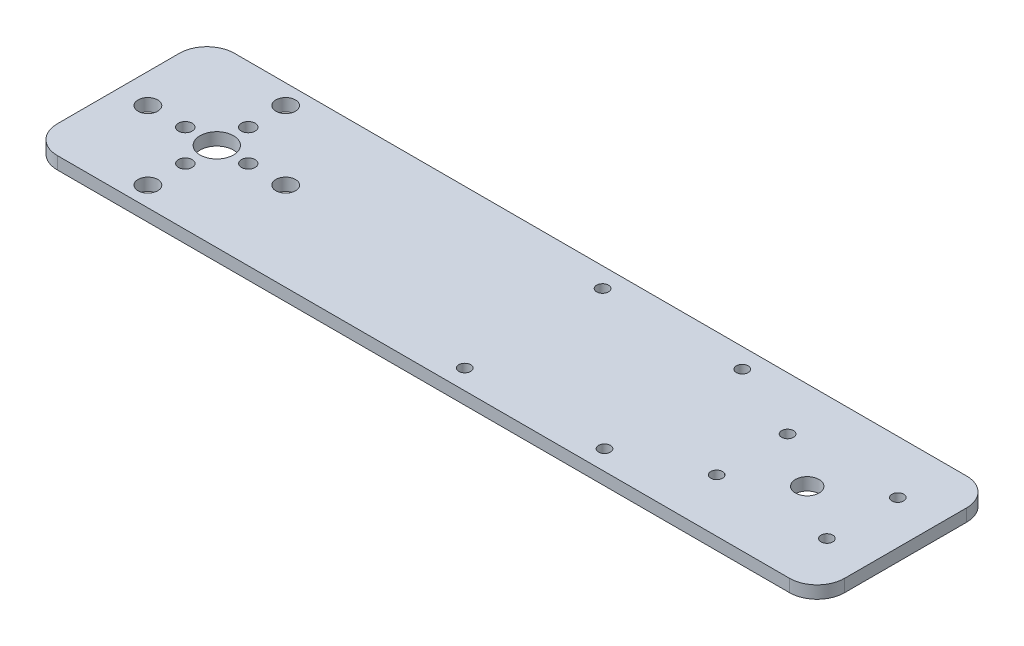
ISO-10303-21;
HEADER;
FILE_DESCRIPTION(('STEP AP214'),'2;1');
FILE_NAME('part.step','',(''),(''),'','','');
FILE_SCHEMA(('AUTOMOTIVE_DESIGN { 1 0 10303 214 1 1 1 1 }'));
ENDSEC;
DATA;
#1=APPLICATION_CONTEXT('core data for automotive mechanical design processes');
#2=APPLICATION_PROTOCOL_DEFINITION('international standard','automotive_design',2000,#1);
#3=PRODUCT_CONTEXT('',#1,'mechanical');
#4=PRODUCT('Part','Part','',(#3));
#5=PRODUCT_RELATED_PRODUCT_CATEGORY('part','',(#4));
#6=PRODUCT_DEFINITION_FORMATION('','',#4);
#7=PRODUCT_DEFINITION_CONTEXT('part definition',#1,'design');
#8=PRODUCT_DEFINITION('design','',#6,#7);
#9=PRODUCT_DEFINITION_SHAPE('','',#8);
#10=(LENGTH_UNIT() NAMED_UNIT(*) SI_UNIT(.MILLI.,.METRE.));
#11=(NAMED_UNIT(*) PLANE_ANGLE_UNIT() SI_UNIT($,.RADIAN.));
#12=(NAMED_UNIT(*) SI_UNIT($,.STERADIAN.) SOLID_ANGLE_UNIT());
#13=UNCERTAINTY_MEASURE_WITH_UNIT(LENGTH_MEASURE(1.E-05),#10,'distance_accuracy_value','');
#14=(GEOMETRIC_REPRESENTATION_CONTEXT(3) GLOBAL_UNCERTAINTY_ASSIGNED_CONTEXT((#13)) GLOBAL_UNIT_ASSIGNED_CONTEXT((#10,
#11,#12)) REPRESENTATION_CONTEXT('',''));
#15=CARTESIAN_POINT('',(0.,0.,0.));
#16=DIRECTION('',(0.,0.,1.));
#17=DIRECTION('',(1.,0.,0.));
#18=AXIS2_PLACEMENT_3D('',#15,#16,#17);
#19=CARTESIAN_POINT('',(-25.,3.175,-22.5));
#20=DIRECTION('',(1.,0.,0.));
#21=DIRECTION('',(0.,0.,-1.));
#22=AXIS2_PLACEMENT_3D('',#19,#20,#21);
#23=PLANE('',#22);
#24=DIRECTION('',(0.,0.,1.));
#25=VECTOR('',#24,1.);
#26=CARTESIAN_POINT('',(-25.,0.,-22.5));
#27=LINE('',#26,#25);
#28=CARTESIAN_POINT('',(-25.,0.,-15.5));
#29=VERTEX_POINT('',#28);
#30=CARTESIAN_POINT('',(-25.,0.,15.5));
#31=VERTEX_POINT('',#30);
#32=EDGE_CURVE('E135',#29,#31,#27,.T.);
#33=ORIENTED_EDGE('',*,*,#32,.T.);
#34=DIRECTION('',(0.,-1.,0.));
#35=VECTOR('',#34,1.);
#36=CARTESIAN_POINT('',(-25.,3.175,15.5));
#37=LINE('',#36,#35);
#38=CARTESIAN_POINT('',(-25.,3.175,15.5));
#39=VERTEX_POINT('',#38);
#40=EDGE_CURVE('E110',#31,#39,#37,.F.);
#41=ORIENTED_EDGE('',*,*,#40,.T.);
#42=DIRECTION('',(0.,0.,1.));
#43=VECTOR('',#42,1.);
#44=CARTESIAN_POINT('',(-25.,3.175,-22.5));
#45=LINE('',#44,#43);
#46=CARTESIAN_POINT('',(-25.,3.175,-15.5));
#47=VERTEX_POINT('',#46);
#48=EDGE_CURVE('E148',#47,#39,#45,.T.);
#49=ORIENTED_EDGE('',*,*,#48,.F.);
#50=DIRECTION('',(0.,-1.,0.));
#51=VECTOR('',#50,1.);
#52=CARTESIAN_POINT('',(-25.,3.175,-15.5));
#53=LINE('',#52,#51);
#54=EDGE_CURVE('E116',#47,#29,#53,.T.);
#55=ORIENTED_EDGE('',*,*,#54,.T.);
#56=EDGE_LOOP('',(#33,#41,#49,#55));
#57=FACE_BOUND('',#56,.T.);
#58=ADVANCED_FACE('F38',(#57),#23,.F.);
#59=CARTESIAN_POINT('',(-25.,3.175,22.5));
#60=DIRECTION('',(0.,0.,-1.));
#61=DIRECTION('',(-1.,0.,0.));
#62=AXIS2_PLACEMENT_3D('',#59,#60,#61);
#63=PLANE('',#62);
#64=DIRECTION('',(1.,0.,0.));
#65=VECTOR('',#64,1.);
#66=CARTESIAN_POINT('',(-25.,3.175,22.5));
#67=LINE('',#66,#65);
#68=CARTESIAN_POINT('',(-18.,3.175,22.5));
#69=VERTEX_POINT('',#68);
#70=CARTESIAN_POINT('',(168.,3.175,22.5));
#71=VERTEX_POINT('',#70);
#72=EDGE_CURVE('E126',#69,#71,#67,.T.);
#73=ORIENTED_EDGE('',*,*,#72,.F.);
#74=DIRECTION('',(0.,-1.,0.));
#75=VECTOR('',#74,1.);
#76=CARTESIAN_POINT('',(-18.,3.175,22.5));
#77=LINE('',#76,#75);
#78=CARTESIAN_POINT('',(-18.,0.,22.5));
#79=VERTEX_POINT('',#78);
#80=EDGE_CURVE('E109',#69,#79,#77,.T.);
#81=ORIENTED_EDGE('',*,*,#80,.T.);
#82=DIRECTION('',(1.,0.,0.));
#83=VECTOR('',#82,1.);
#84=CARTESIAN_POINT('',(-25.,0.,22.5));
#85=LINE('',#84,#83);
#86=CARTESIAN_POINT('',(168.,0.,22.5));
#87=VERTEX_POINT('',#86);
#88=EDGE_CURVE('E123',#79,#87,#85,.T.);
#89=ORIENTED_EDGE('',*,*,#88,.T.);
#90=DIRECTION('',(0.,-1.,0.));
#91=VECTOR('',#90,1.);
#92=CARTESIAN_POINT('',(168.,3.175,22.5));
#93=LINE('',#92,#91);
#94=EDGE_CURVE('E129',#87,#71,#93,.F.);
#95=ORIENTED_EDGE('',*,*,#94,.T.);
#96=EDGE_LOOP('',(#73,#81,#89,#95));
#97=FACE_BOUND('',#96,.T.);
#98=ADVANCED_FACE('F122',(#97),#63,.F.);
#99=CARTESIAN_POINT('',(175.,3.175,-22.5));
#100=DIRECTION('',(-1.,0.,0.));
#101=DIRECTION('',(0.,0.,1.));
#102=AXIS2_PLACEMENT_3D('',#99,#100,#101);
#103=PLANE('',#102);
#104=DIRECTION('',(0.,0.,-1.));
#105=VECTOR('',#104,1.);
#106=CARTESIAN_POINT('',(175.,0.,-22.5));
#107=LINE('',#106,#105);
#108=CARTESIAN_POINT('',(175.,0.,15.5));
#109=VERTEX_POINT('',#108);
#110=CARTESIAN_POINT('',(175.,0.,-15.5));
#111=VERTEX_POINT('',#110);
#112=EDGE_CURVE('E134',#109,#111,#107,.T.);
#113=ORIENTED_EDGE('',*,*,#112,.T.);
#114=DIRECTION('',(0.,-1.,0.));
#115=VECTOR('',#114,1.);
#116=CARTESIAN_POINT('',(175.,3.175,-15.5));
#117=LINE('',#116,#115);
#118=CARTESIAN_POINT('',(175.,3.175,-15.5));
#119=VERTEX_POINT('',#118);
#120=EDGE_CURVE('E11',#111,#119,#117,.F.);
#121=ORIENTED_EDGE('',*,*,#120,.T.);
#122=DIRECTION('',(0.,0.,-1.));
#123=VECTOR('',#122,1.);
#124=CARTESIAN_POINT('',(175.,3.175,-22.5));
#125=LINE('',#124,#123);
#126=CARTESIAN_POINT('',(175.,3.175,15.5));
#127=VERTEX_POINT('',#126);
#128=EDGE_CURVE('E187',#127,#119,#125,.T.);
#129=ORIENTED_EDGE('',*,*,#128,.F.);
#130=DIRECTION('',(0.,-1.,0.));
#131=VECTOR('',#130,1.);
#132=CARTESIAN_POINT('',(175.,3.175,15.5));
#133=LINE('',#132,#131);
#134=EDGE_CURVE('E47',#127,#109,#133,.T.);
#135=ORIENTED_EDGE('',*,*,#134,.T.);
#136=EDGE_LOOP('',(#113,#121,#129,#135));
#137=FACE_BOUND('',#136,.T.);
#138=ADVANCED_FACE('F185',(#137),#103,.F.);
#139=CARTESIAN_POINT('',(-25.,3.175,-22.5));
#140=DIRECTION('',(0.,0.,1.));
#141=DIRECTION('',(1.,0.,0.));
#142=AXIS2_PLACEMENT_3D('',#139,#140,#141);
#143=PLANE('',#142);
#144=DIRECTION('',(-1.,0.,0.));
#145=VECTOR('',#144,1.);
#146=CARTESIAN_POINT('',(-25.,0.,-22.5));
#147=LINE('',#146,#145);
#148=CARTESIAN_POINT('',(168.,0.,-22.5));
#149=VERTEX_POINT('',#148);
#150=CARTESIAN_POINT('',(-18.,0.,-22.5));
#151=VERTEX_POINT('',#150);
#152=EDGE_CURVE('E140',#149,#151,#147,.T.);
#153=ORIENTED_EDGE('',*,*,#152,.T.);
#154=DIRECTION('',(0.,-1.,0.));
#155=VECTOR('',#154,1.);
#156=CARTESIAN_POINT('',(-18.,3.175,-22.5));
#157=LINE('',#156,#155);
#158=CARTESIAN_POINT('',(-18.,3.175,-22.5));
#159=VERTEX_POINT('',#158);
#160=EDGE_CURVE('E54',#151,#159,#157,.F.);
#161=ORIENTED_EDGE('',*,*,#160,.T.);
#162=DIRECTION('',(-1.,0.,0.));
#163=VECTOR('',#162,1.);
#164=CARTESIAN_POINT('',(-25.,3.175,-22.5));
#165=LINE('',#164,#163);
#166=CARTESIAN_POINT('',(168.,3.175,-22.5));
#167=VERTEX_POINT('',#166);
#168=EDGE_CURVE('E150',#167,#159,#165,.T.);
#169=ORIENTED_EDGE('',*,*,#168,.F.);
#170=DIRECTION('',(0.,-1.,0.));
#171=VECTOR('',#170,1.);
#172=CARTESIAN_POINT('',(168.,3.175,-22.5));
#173=LINE('',#172,#171);
#174=EDGE_CURVE('E175',#167,#149,#173,.T.);
#175=ORIENTED_EDGE('',*,*,#174,.T.);
#176=EDGE_LOOP('',(#153,#161,#169,#175));
#177=FACE_BOUND('',#176,.T.);
#178=ADVANCED_FACE('F194',(#177),#143,.F.);
#179=CARTESIAN_POINT('',(0.,3.175,0.));
#180=DIRECTION('',(0.,1.,0.));
#181=DIRECTION('',(0.,0.,1.));
#182=AXIS2_PLACEMENT_3D('',#179,#180,#181);
#183=PLANE('',#182);
#184=CARTESIAN_POINT('',(0.,3.175,-8.));
#185=DIRECTION('',(0.,1.,0.));
#186=DIRECTION('',(0.,0.,1.));
#187=AXIS2_PLACEMENT_3D('',#184,#185,#186);
#188=CIRCLE('',#187,1.75);
#189=CARTESIAN_POINT('',(0.,3.175,-6.25));
#190=VERTEX_POINT('',#189);
#191=EDGE_CURVE('E341',#190,#190,#188,.T.);
#192=ORIENTED_EDGE('',*,*,#191,.F.);
#193=EDGE_LOOP('',(#192));
#194=FACE_BOUND('',#193,.T.);
#195=CARTESIAN_POINT('',(8.00000000000012,3.175,0.));
#196=DIRECTION('',(0.,1.,0.));
#197=DIRECTION('',(0.,0.,1.));
#198=AXIS2_PLACEMENT_3D('',#195,#196,#197);
#199=CIRCLE('',#198,1.74999999999994);
#200=CARTESIAN_POINT('',(8.00000000000012,3.175,1.75));
#201=VERTEX_POINT('',#200);
#202=EDGE_CURVE('E333',#201,#201,#199,.T.);
#203=ORIENTED_EDGE('',*,*,#202,.F.);
#204=EDGE_LOOP('',(#203));
#205=FACE_BOUND('',#204,.T.);
#206=CARTESIAN_POINT('',(2.29963216268258E-13,3.175,8.00000000000011));
#207=DIRECTION('',(0.,1.,0.));
#208=DIRECTION('',(0.,0.,1.));
#209=AXIS2_PLACEMENT_3D('',#206,#207,#208);
#210=CIRCLE('',#209,1.75000000000024);
#211=CARTESIAN_POINT('',(2.29963216268258E-13,3.175,9.75000000000035));
#212=VERTEX_POINT('',#211);
#213=EDGE_CURVE('E325',#212,#212,#210,.T.);
#214=ORIENTED_EDGE('',*,*,#213,.F.);
#215=EDGE_LOOP('',(#214));
#216=FACE_BOUND('',#215,.T.);
#217=CARTESIAN_POINT('',(-7.99999999999977,3.175,0.));
#218=DIRECTION('',(0.,1.,0.));
#219=DIRECTION('',(0.,0.,1.));
#220=AXIS2_PLACEMENT_3D('',#217,#218,#219);
#221=CIRCLE('',#220,1.75000000000015);
#222=CARTESIAN_POINT('',(-7.99999999999977,3.175,1.75000000000015));
#223=VERTEX_POINT('',#222);
#224=EDGE_CURVE('E317',#223,#223,#221,.T.);
#225=ORIENTED_EDGE('',*,*,#224,.F.);
#226=EDGE_LOOP('',(#225));
#227=FACE_BOUND('',#226,.T.);
#228=CARTESIAN_POINT('',(0.,3.175,-17.5));
#229=DIRECTION('',(0.,1.,0.));
#230=DIRECTION('',(0.,0.,1.));
#231=AXIS2_PLACEMENT_3D('',#228,#229,#230);
#232=CIRCLE('',#231,2.5);
#233=CARTESIAN_POINT('',(0.,3.175,-15.));
#234=VERTEX_POINT('',#233);
#235=EDGE_CURVE('E310',#234,#234,#232,.T.);
#236=ORIENTED_EDGE('',*,*,#235,.F.);
#237=EDGE_LOOP('',(#236));
#238=FACE_BOUND('',#237,.T.);
#239=CARTESIAN_POINT('',(17.5,3.175,0.));
#240=DIRECTION('',(0.,1.,0.));
#241=DIRECTION('',(0.,0.,1.));
#242=AXIS2_PLACEMENT_3D('',#239,#240,#241);
#243=CIRCLE('',#242,2.5);
#244=CARTESIAN_POINT('',(17.5,3.175,2.50000000000006));
#245=VERTEX_POINT('',#244);
#246=EDGE_CURVE('E302',#245,#245,#243,.T.);
#247=ORIENTED_EDGE('',*,*,#246,.F.);
#248=EDGE_LOOP('',(#247));
#249=FACE_BOUND('',#248,.T.);
#250=CARTESIAN_POINT('',(-1.22814170259083E-13,3.175,17.5));
#251=DIRECTION('',(0.,1.,0.));
#252=DIRECTION('',(0.,0.,1.));
#253=AXIS2_PLACEMENT_3D('',#250,#251,#252);
#254=CIRCLE('',#253,2.5);
#255=CARTESIAN_POINT('',(-1.22814170259083E-13,3.175,20.));
#256=VERTEX_POINT('',#255);
#257=EDGE_CURVE('E294',#256,#256,#254,.T.);
#258=ORIENTED_EDGE('',*,*,#257,.F.);
#259=EDGE_LOOP('',(#258));
#260=FACE_BOUND('',#259,.T.);
#261=CARTESIAN_POINT('',(-17.5,3.175,-1.83915093688838E-13));
#262=DIRECTION('',(0.,1.,0.));
#263=DIRECTION('',(0.,0.,1.));
#264=AXIS2_PLACEMENT_3D('',#261,#262,#263);
#265=CIRCLE('',#264,2.5);
#266=CARTESIAN_POINT('',(-17.5,3.175,2.49999999999982));
#267=VERTEX_POINT('',#266);
#268=EDGE_CURVE('E285',#267,#267,#265,.T.);
#269=ORIENTED_EDGE('',*,*,#268,.F.);
#270=EDGE_LOOP('',(#269));
#271=FACE_BOUND('',#270,.T.);
#272=CARTESIAN_POINT('',(80.5,3.175,-17.5));
#273=DIRECTION('',(0.,1.,0.));
#274=DIRECTION('',(0.,0.,-1.));
#275=AXIS2_PLACEMENT_3D('',#272,#273,#274);
#276=CIRCLE('',#275,1.5);
#277=CARTESIAN_POINT('',(80.5,3.175,-19.));
#278=VERTEX_POINT('',#277);
#279=EDGE_CURVE('E261',#278,#278,#276,.T.);
#280=ORIENTED_EDGE('',*,*,#279,.F.);
#281=EDGE_LOOP('',(#280));
#282=FACE_BOUND('',#281,.T.);
#283=CARTESIAN_POINT('',(116.,3.175,-17.5));
#284=DIRECTION('',(0.,1.,0.));
#285=DIRECTION('',(0.,0.,-1.));
#286=AXIS2_PLACEMENT_3D('',#283,#284,#285);
#287=CIRCLE('',#286,1.5);
#288=CARTESIAN_POINT('',(116.,3.175,-19.));
#289=VERTEX_POINT('',#288);
#290=EDGE_CURVE('E270',#289,#289,#287,.T.);
#291=ORIENTED_EDGE('',*,*,#290,.F.);
#292=EDGE_LOOP('',(#291));
#293=FACE_BOUND('',#292,.T.);
#294=CARTESIAN_POINT('',(116.,3.175,17.5));
#295=DIRECTION('',(0.,1.,0.));
#296=DIRECTION('',(0.,0.,1.));
#297=AXIS2_PLACEMENT_3D('',#294,#295,#296);
#298=CIRCLE('',#297,1.5);
#299=CARTESIAN_POINT('',(116.,3.175,19.));
#300=VERTEX_POINT('',#299);
#301=EDGE_CURVE('E278',#300,#300,#298,.T.);
#302=ORIENTED_EDGE('',*,*,#301,.F.);
#303=EDGE_LOOP('',(#302));
#304=FACE_BOUND('',#303,.T.);
#305=CARTESIAN_POINT('',(80.5,3.175,17.5));
#306=DIRECTION('',(0.,1.,0.));
#307=DIRECTION('',(0.,0.,1.));
#308=AXIS2_PLACEMENT_3D('',#305,#306,#307);
#309=CIRCLE('',#308,1.5);
#310=CARTESIAN_POINT('',(80.5,3.175,19.));
#311=VERTEX_POINT('',#310);
#312=EDGE_CURVE('E253',#311,#311,#309,.T.);
#313=ORIENTED_EDGE('',*,*,#312,.F.);
#314=EDGE_LOOP('',(#313));
#315=FACE_BOUND('',#314,.T.);
#316=CARTESIAN_POINT('',(0.,3.175,0.));
#317=DIRECTION('',(0.,1.,0.));
#318=DIRECTION('',(0.,0.,1.));
#319=AXIS2_PLACEMENT_3D('',#316,#317,#318);
#320=CIRCLE('',#319,4.25);
#321=CARTESIAN_POINT('',(0.,3.175,4.25));
#322=VERTEX_POINT('',#321);
#323=EDGE_CURVE('E245',#322,#322,#320,.T.);
#324=ORIENTED_EDGE('',*,*,#323,.F.);
#325=EDGE_LOOP('',(#324));
#326=FACE_BOUND('',#325,.T.);
#327=CARTESIAN_POINT('',(136.,3.175,9.));
#328=DIRECTION('',(0.,1.,0.));
#329=DIRECTION('',(0.,0.,-1.));
#330=AXIS2_PLACEMENT_3D('',#327,#328,#329);
#331=CIRCLE('',#330,1.5);
#332=CARTESIAN_POINT('',(136.,3.175,7.5));
#333=VERTEX_POINT('',#332);
#334=EDGE_CURVE('E213',#333,#333,#331,.T.);
#335=ORIENTED_EDGE('',*,*,#334,.F.);
#336=EDGE_LOOP('',(#335));
#337=FACE_BOUND('',#336,.T.);
#338=CARTESIAN_POINT('',(164.,3.175,9.));
#339=DIRECTION('',(0.,1.,0.));
#340=DIRECTION('',(0.,0.,1.));
#341=AXIS2_PLACEMENT_3D('',#338,#339,#340);
#342=CIRCLE('',#341,1.50000000000003);
#343=CARTESIAN_POINT('',(164.,3.175,10.5));
#344=VERTEX_POINT('',#343);
#345=EDGE_CURVE('E222',#344,#344,#342,.T.);
#346=ORIENTED_EDGE('',*,*,#345,.F.);
#347=EDGE_LOOP('',(#346));
#348=FACE_BOUND('',#347,.T.);
#349=CARTESIAN_POINT('',(164.,3.175,-9.));
#350=DIRECTION('',(0.,1.,0.));
#351=DIRECTION('',(0.,0.,-1.));
#352=AXIS2_PLACEMENT_3D('',#349,#350,#351);
#353=CIRCLE('',#352,1.50000000000003);
#354=CARTESIAN_POINT('',(164.,3.175,-10.5));
#355=VERTEX_POINT('',#354);
#356=EDGE_CURVE('E230',#355,#355,#353,.T.);
#357=ORIENTED_EDGE('',*,*,#356,.F.);
#358=EDGE_LOOP('',(#357));
#359=FACE_BOUND('',#358,.T.);
#360=CARTESIAN_POINT('',(136.,3.175,-9.));
#361=DIRECTION('',(0.,1.,0.));
#362=DIRECTION('',(0.,0.,1.));
#363=AXIS2_PLACEMENT_3D('',#360,#361,#362);
#364=CIRCLE('',#363,1.5);
#365=CARTESIAN_POINT('',(136.,3.175,-7.5));
#366=VERTEX_POINT('',#365);
#367=EDGE_CURVE('E238',#366,#366,#364,.T.);
#368=ORIENTED_EDGE('',*,*,#367,.F.);
#369=EDGE_LOOP('',(#368));
#370=FACE_BOUND('',#369,.T.);
#371=CARTESIAN_POINT('',(150.,3.175,0.));
#372=DIRECTION('',(0.,1.,0.));
#373=DIRECTION('',(0.,0.,1.));
#374=AXIS2_PLACEMENT_3D('',#371,#372,#373);
#375=CIRCLE('',#374,2.99999999999999);
#376=CARTESIAN_POINT('',(150.,3.175,2.99999999999999));
#377=VERTEX_POINT('',#376);
#378=EDGE_CURVE('E205',#377,#377,#375,.T.);
#379=ORIENTED_EDGE('',*,*,#378,.F.);
#380=EDGE_LOOP('',(#379));
#381=FACE_BOUND('',#380,.T.);
#382=ORIENTED_EDGE('',*,*,#48,.T.);
#383=CARTESIAN_POINT('',(-18.,3.175,15.5));
#384=DIRECTION('',(0.,1.,0.));
#385=DIRECTION('',(0.,0.,1.));
#386=AXIS2_PLACEMENT_3D('',#383,#384,#385);
#387=CIRCLE('',#386,7.);
#388=EDGE_CURVE('E172',#39,#69,#387,.T.);
#389=ORIENTED_EDGE('',*,*,#388,.T.);
#390=ORIENTED_EDGE('',*,*,#72,.T.);
#391=CARTESIAN_POINT('',(168.,3.175,15.5));
#392=DIRECTION('',(0.,1.,0.));
#393=DIRECTION('',(0.,0.,1.));
#394=AXIS2_PLACEMENT_3D('',#391,#392,#393);
#395=CIRCLE('',#394,7.);
#396=EDGE_CURVE('E164',#71,#127,#395,.T.);
#397=ORIENTED_EDGE('',*,*,#396,.T.);
#398=ORIENTED_EDGE('',*,*,#128,.T.);
#399=CARTESIAN_POINT('',(168.,3.175,-15.5));
#400=DIRECTION('',(0.,1.,0.));
#401=DIRECTION('',(0.,0.,1.));
#402=AXIS2_PLACEMENT_3D('',#399,#400,#401);
#403=CIRCLE('',#402,7.);
#404=EDGE_CURVE('E61',#119,#167,#403,.T.);
#405=ORIENTED_EDGE('',*,*,#404,.T.);
#406=ORIENTED_EDGE('',*,*,#168,.T.);
#407=CARTESIAN_POINT('',(-18.,3.175,-15.5));
#408=DIRECTION('',(0.,1.,0.));
#409=DIRECTION('',(0.,0.,1.));
#410=AXIS2_PLACEMENT_3D('',#407,#408,#409);
#411=CIRCLE('',#410,7.);
#412=EDGE_CURVE('E169',#159,#47,#411,.T.);
#413=ORIENTED_EDGE('',*,*,#412,.T.);
#414=EDGE_LOOP('',(#382,#389,#390,#397,#398,#405,#406,#413));
#415=FACE_BOUND('',#414,.T.);
#416=ADVANCED_FACE('F358',(#194,#205,#216,#227,#238,#249,#260,#271,#282,#293,#304,#315,#326,
#337,#348,#359,#370,#381,#415),#183,.T.);
#417=CARTESIAN_POINT('',(0.,0.,0.));
#418=DIRECTION('',(0.,1.,0.));
#419=DIRECTION('',(0.,0.,1.));
#420=AXIS2_PLACEMENT_3D('',#417,#418,#419);
#421=PLANE('',#420);
#422=CARTESIAN_POINT('',(0.,0.,-8.));
#423=DIRECTION('',(0.,1.,0.));
#424=DIRECTION('',(0.,0.,1.));
#425=AXIS2_PLACEMENT_3D('',#422,#423,#424);
#426=CIRCLE('',#425,1.75);
#427=CARTESIAN_POINT('',(0.,0.,-6.25));
#428=VERTEX_POINT('',#427);
#429=EDGE_CURVE('E290',#428,#428,#426,.T.);
#430=ORIENTED_EDGE('',*,*,#429,.T.);
#431=EDGE_LOOP('',(#430));
#432=FACE_BOUND('',#431,.T.);
#433=CARTESIAN_POINT('',(8.00000000000012,0.,0.));
#434=DIRECTION('',(0.,1.,0.));
#435=DIRECTION('',(0.,0.,1.));
#436=AXIS2_PLACEMENT_3D('',#433,#434,#435);
#437=CIRCLE('',#436,1.74999999999994);
#438=CARTESIAN_POINT('',(8.00000000000012,0.,1.75));
#439=VERTEX_POINT('',#438);
#440=EDGE_CURVE('E337',#439,#439,#437,.T.);
#441=ORIENTED_EDGE('',*,*,#440,.T.);
#442=EDGE_LOOP('',(#441));
#443=FACE_BOUND('',#442,.T.);
#444=CARTESIAN_POINT('',(2.29963216268258E-13,0.,8.00000000000011));
#445=DIRECTION('',(0.,1.,0.));
#446=DIRECTION('',(0.,0.,1.));
#447=AXIS2_PLACEMENT_3D('',#444,#445,#446);
#448=CIRCLE('',#447,1.75000000000024);
#449=CARTESIAN_POINT('',(2.29963216268258E-13,0.,9.75000000000035));
#450=VERTEX_POINT('',#449);
#451=EDGE_CURVE('E329',#450,#450,#448,.T.);
#452=ORIENTED_EDGE('',*,*,#451,.T.);
#453=EDGE_LOOP('',(#452));
#454=FACE_BOUND('',#453,.T.);
#455=CARTESIAN_POINT('',(-7.99999999999977,0.,0.));
#456=DIRECTION('',(0.,1.,0.));
#457=DIRECTION('',(0.,0.,1.));
#458=AXIS2_PLACEMENT_3D('',#455,#456,#457);
#459=CIRCLE('',#458,1.75000000000015);
#460=CARTESIAN_POINT('',(-7.99999999999977,0.,1.75000000000015));
#461=VERTEX_POINT('',#460);
#462=EDGE_CURVE('E321',#461,#461,#459,.T.);
#463=ORIENTED_EDGE('',*,*,#462,.T.);
#464=EDGE_LOOP('',(#463));
#465=FACE_BOUND('',#464,.T.);
#466=CARTESIAN_POINT('',(0.,0.,-17.5));
#467=DIRECTION('',(0.,1.,0.));
#468=DIRECTION('',(0.,0.,1.));
#469=AXIS2_PLACEMENT_3D('',#466,#467,#468);
#470=CIRCLE('',#469,2.5);
#471=CARTESIAN_POINT('',(0.,0.,-15.));
#472=VERTEX_POINT('',#471);
#473=EDGE_CURVE('E266',#472,#472,#470,.T.);
#474=ORIENTED_EDGE('',*,*,#473,.T.);
#475=EDGE_LOOP('',(#474));
#476=FACE_BOUND('',#475,.T.);
#477=CARTESIAN_POINT('',(17.5,0.,0.));
#478=DIRECTION('',(0.,1.,0.));
#479=DIRECTION('',(0.,0.,1.));
#480=AXIS2_PLACEMENT_3D('',#477,#478,#479);
#481=CIRCLE('',#480,2.5);
#482=CARTESIAN_POINT('',(17.5,0.,2.50000000000006));
#483=VERTEX_POINT('',#482);
#484=EDGE_CURVE('E306',#483,#483,#481,.T.);
#485=ORIENTED_EDGE('',*,*,#484,.T.);
#486=EDGE_LOOP('',(#485));
#487=FACE_BOUND('',#486,.T.);
#488=CARTESIAN_POINT('',(-1.22814170259083E-13,0.,17.5));
#489=DIRECTION('',(0.,1.,0.));
#490=DIRECTION('',(0.,0.,1.));
#491=AXIS2_PLACEMENT_3D('',#488,#489,#490);
#492=CIRCLE('',#491,2.5);
#493=CARTESIAN_POINT('',(-1.22814170259083E-13,0.,20.));
#494=VERTEX_POINT('',#493);
#495=EDGE_CURVE('E298',#494,#494,#492,.T.);
#496=ORIENTED_EDGE('',*,*,#495,.T.);
#497=EDGE_LOOP('',(#496));
#498=FACE_BOUND('',#497,.T.);
#499=CARTESIAN_POINT('',(-17.5,0.,-1.83915093688838E-13));
#500=DIRECTION('',(0.,1.,0.));
#501=DIRECTION('',(0.,0.,1.));
#502=AXIS2_PLACEMENT_3D('',#499,#500,#501);
#503=CIRCLE('',#502,2.5);
#504=CARTESIAN_POINT('',(-17.5,0.,2.49999999999982));
#505=VERTEX_POINT('',#504);
#506=EDGE_CURVE('E289',#505,#505,#503,.T.);
#507=ORIENTED_EDGE('',*,*,#506,.T.);
#508=EDGE_LOOP('',(#507));
#509=FACE_BOUND('',#508,.T.);
#510=CARTESIAN_POINT('',(80.5,0.,-17.5));
#511=DIRECTION('',(0.,1.,0.));
#512=DIRECTION('',(0.,0.,-1.));
#513=AXIS2_PLACEMENT_3D('',#510,#511,#512);
#514=CIRCLE('',#513,1.5);
#515=CARTESIAN_POINT('',(80.5,0.,-19.));
#516=VERTEX_POINT('',#515);
#517=EDGE_CURVE('E265',#516,#516,#514,.T.);
#518=ORIENTED_EDGE('',*,*,#517,.T.);
#519=EDGE_LOOP('',(#518));
#520=FACE_BOUND('',#519,.T.);
#521=CARTESIAN_POINT('',(116.,0.,-17.5));
#522=DIRECTION('',(0.,1.,0.));
#523=DIRECTION('',(0.,0.,-1.));
#524=AXIS2_PLACEMENT_3D('',#521,#522,#523);
#525=CIRCLE('',#524,1.5);
#526=CARTESIAN_POINT('',(116.,0.,-19.));
#527=VERTEX_POINT('',#526);
#528=EDGE_CURVE('E274',#527,#527,#525,.T.);
#529=ORIENTED_EDGE('',*,*,#528,.T.);
#530=EDGE_LOOP('',(#529));
#531=FACE_BOUND('',#530,.T.);
#532=CARTESIAN_POINT('',(116.,0.,17.5));
#533=DIRECTION('',(0.,1.,0.));
#534=DIRECTION('',(0.,0.,1.));
#535=AXIS2_PLACEMENT_3D('',#532,#533,#534);
#536=CIRCLE('',#535,1.5);
#537=CARTESIAN_POINT('',(116.,0.,19.));
#538=VERTEX_POINT('',#537);
#539=EDGE_CURVE('E257',#538,#538,#536,.T.);
#540=ORIENTED_EDGE('',*,*,#539,.T.);
#541=EDGE_LOOP('',(#540));
#542=FACE_BOUND('',#541,.T.);
#543=CARTESIAN_POINT('',(80.5,0.,17.5));
#544=DIRECTION('',(0.,1.,0.));
#545=DIRECTION('',(0.,0.,1.));
#546=AXIS2_PLACEMENT_3D('',#543,#544,#545);
#547=CIRCLE('',#546,1.5);
#548=CARTESIAN_POINT('',(80.5,0.,19.));
#549=VERTEX_POINT('',#548);
#550=EDGE_CURVE('E249',#549,#549,#547,.T.);
#551=ORIENTED_EDGE('',*,*,#550,.T.);
#552=EDGE_LOOP('',(#551));
#553=FACE_BOUND('',#552,.T.);
#554=CARTESIAN_POINT('',(0.,0.,0.));
#555=DIRECTION('',(0.,1.,0.));
#556=DIRECTION('',(0.,0.,1.));
#557=AXIS2_PLACEMENT_3D('',#554,#555,#556);
#558=CIRCLE('',#557,4.25);
#559=CARTESIAN_POINT('',(0.,0.,4.25));
#560=VERTEX_POINT('',#559);
#561=EDGE_CURVE('E218',#560,#560,#558,.T.);
#562=ORIENTED_EDGE('',*,*,#561,.T.);
#563=EDGE_LOOP('',(#562));
#564=FACE_BOUND('',#563,.T.);
#565=CARTESIAN_POINT('',(136.,0.,9.));
#566=DIRECTION('',(0.,1.,0.));
#567=DIRECTION('',(0.,0.,-1.));
#568=AXIS2_PLACEMENT_3D('',#565,#566,#567);
#569=CIRCLE('',#568,1.5);
#570=CARTESIAN_POINT('',(136.,0.,7.5));
#571=VERTEX_POINT('',#570);
#572=EDGE_CURVE('E217',#571,#571,#569,.T.);
#573=ORIENTED_EDGE('',*,*,#572,.T.);
#574=EDGE_LOOP('',(#573));
#575=FACE_BOUND('',#574,.T.);
#576=CARTESIAN_POINT('',(164.,0.,9.));
#577=DIRECTION('',(0.,1.,0.));
#578=DIRECTION('',(0.,0.,1.));
#579=AXIS2_PLACEMENT_3D('',#576,#577,#578);
#580=CIRCLE('',#579,1.50000000000003);
#581=CARTESIAN_POINT('',(164.,0.,10.5));
#582=VERTEX_POINT('',#581);
#583=EDGE_CURVE('E226',#582,#582,#580,.T.);
#584=ORIENTED_EDGE('',*,*,#583,.T.);
#585=EDGE_LOOP('',(#584));
#586=FACE_BOUND('',#585,.T.);
#587=CARTESIAN_POINT('',(164.,0.,-9.));
#588=DIRECTION('',(0.,1.,0.));
#589=DIRECTION('',(0.,0.,-1.));
#590=AXIS2_PLACEMENT_3D('',#587,#588,#589);
#591=CIRCLE('',#590,1.50000000000003);
#592=CARTESIAN_POINT('',(164.,0.,-10.5));
#593=VERTEX_POINT('',#592);
#594=EDGE_CURVE('E234',#593,#593,#591,.T.);
#595=ORIENTED_EDGE('',*,*,#594,.T.);
#596=EDGE_LOOP('',(#595));
#597=FACE_BOUND('',#596,.T.);
#598=CARTESIAN_POINT('',(136.,0.,-9.));
#599=DIRECTION('',(0.,1.,0.));
#600=DIRECTION('',(0.,0.,1.));
#601=AXIS2_PLACEMENT_3D('',#598,#599,#600);
#602=CIRCLE('',#601,1.5);
#603=CARTESIAN_POINT('',(136.,0.,-7.5));
#604=VERTEX_POINT('',#603);
#605=EDGE_CURVE('E209',#604,#604,#602,.T.);
#606=ORIENTED_EDGE('',*,*,#605,.T.);
#607=EDGE_LOOP('',(#606));
#608=FACE_BOUND('',#607,.T.);
#609=CARTESIAN_POINT('',(150.,0.,0.));
#610=DIRECTION('',(0.,1.,0.));
#611=DIRECTION('',(0.,0.,1.));
#612=AXIS2_PLACEMENT_3D('',#609,#610,#611);
#613=CIRCLE('',#612,2.99999999999999);
#614=CARTESIAN_POINT('',(150.,0.,2.99999999999999));
#615=VERTEX_POINT('',#614);
#616=EDGE_CURVE('E142',#615,#615,#613,.T.);
#617=ORIENTED_EDGE('',*,*,#616,.T.);
#618=EDGE_LOOP('',(#617));
#619=FACE_BOUND('',#618,.T.);
#620=ORIENTED_EDGE('',*,*,#88,.F.);
#621=CARTESIAN_POINT('',(-18.,0.,15.5));
#622=DIRECTION('',(0.,1.,0.));
#623=DIRECTION('',(0.,0.,1.));
#624=AXIS2_PLACEMENT_3D('',#621,#622,#623);
#625=CIRCLE('',#624,7.);
#626=EDGE_CURVE('E105',#79,#31,#625,.F.);
#627=ORIENTED_EDGE('',*,*,#626,.T.);
#628=ORIENTED_EDGE('',*,*,#32,.F.);
#629=CARTESIAN_POINT('',(-18.,0.,-15.5));
#630=DIRECTION('',(0.,1.,0.));
#631=DIRECTION('',(0.,0.,1.));
#632=AXIS2_PLACEMENT_3D('',#629,#630,#631);
#633=CIRCLE('',#632,7.);
#634=EDGE_CURVE('E117',#29,#151,#633,.F.);
#635=ORIENTED_EDGE('',*,*,#634,.T.);
#636=ORIENTED_EDGE('',*,*,#152,.F.);
#637=CARTESIAN_POINT('',(168.,0.,-15.5));
#638=DIRECTION('',(0.,1.,0.));
#639=DIRECTION('',(0.,0.,1.));
#640=AXIS2_PLACEMENT_3D('',#637,#638,#639);
#641=CIRCLE('',#640,7.);
#642=EDGE_CURVE('E154',#149,#111,#641,.F.);
#643=ORIENTED_EDGE('',*,*,#642,.T.);
#644=ORIENTED_EDGE('',*,*,#112,.F.);
#645=CARTESIAN_POINT('',(168.,0.,15.5));
#646=DIRECTION('',(0.,1.,0.));
#647=DIRECTION('',(0.,0.,1.));
#648=AXIS2_PLACEMENT_3D('',#645,#646,#647);
#649=CIRCLE('',#648,7.);
#650=EDGE_CURVE('E128',#109,#87,#649,.F.);
#651=ORIENTED_EDGE('',*,*,#650,.T.);
#652=EDGE_LOOP('',(#620,#627,#628,#635,#636,#643,#644,#651));
#653=FACE_BOUND('',#652,.T.);
#654=ADVANCED_FACE('F131',(#432,#443,#454,#465,#476,#487,#498,#509,#520,#531,#542,#553,#564,
#575,#586,#597,#608,#619,#653),#421,.F.);
#655=CARTESIAN_POINT('',(150.,0.,0.));
#656=DIRECTION('',(0.,1.,0.));
#657=DIRECTION('',(0.,0.,1.));
#658=AXIS2_PLACEMENT_3D('',#655,#656,#657);
#659=CYLINDRICAL_SURFACE('',#658,2.99999999999999);
#660=ORIENTED_EDGE('',*,*,#616,.F.);
#661=EDGE_LOOP('',(#660));
#662=FACE_BOUND('',#661,.T.);
#663=ORIENTED_EDGE('',*,*,#378,.T.);
#664=EDGE_LOOP('',(#663));
#665=FACE_BOUND('',#664,.T.);
#666=ADVANCED_FACE('F420',(#662,#665),#659,.F.);
#667=CARTESIAN_POINT('',(136.,0.,-9.));
#668=DIRECTION('',(0.,1.,0.));
#669=DIRECTION('',(0.,0.,1.));
#670=AXIS2_PLACEMENT_3D('',#667,#668,#669);
#671=CYLINDRICAL_SURFACE('',#670,1.5);
#672=ORIENTED_EDGE('',*,*,#605,.F.);
#673=EDGE_LOOP('',(#672));
#674=FACE_BOUND('',#673,.T.);
#675=ORIENTED_EDGE('',*,*,#367,.T.);
#676=EDGE_LOOP('',(#675));
#677=FACE_BOUND('',#676,.T.);
#678=ADVANCED_FACE('F424',(#674,#677),#671,.F.);
#679=CARTESIAN_POINT('',(164.,0.,-9.));
#680=DIRECTION('',(0.,1.,0.));
#681=DIRECTION('',(0.,0.,1.));
#682=AXIS2_PLACEMENT_3D('',#679,#680,#681);
#683=CYLINDRICAL_SURFACE('',#682,1.50000000000003);
#684=ORIENTED_EDGE('',*,*,#594,.F.);
#685=EDGE_LOOP('',(#684));
#686=FACE_BOUND('',#685,.T.);
#687=ORIENTED_EDGE('',*,*,#356,.T.);
#688=EDGE_LOOP('',(#687));
#689=FACE_BOUND('',#688,.T.);
#690=ADVANCED_FACE('F434',(#686,#689),#683,.F.);
#691=CARTESIAN_POINT('',(164.,0.,9.));
#692=DIRECTION('',(0.,1.,0.));
#693=DIRECTION('',(0.,0.,1.));
#694=AXIS2_PLACEMENT_3D('',#691,#692,#693);
#695=CYLINDRICAL_SURFACE('',#694,1.50000000000003);
#696=ORIENTED_EDGE('',*,*,#583,.F.);
#697=EDGE_LOOP('',(#696));
#698=FACE_BOUND('',#697,.T.);
#699=ORIENTED_EDGE('',*,*,#345,.T.);
#700=EDGE_LOOP('',(#699));
#701=FACE_BOUND('',#700,.T.);
#702=ADVANCED_FACE('F430',(#698,#701),#695,.F.);
#703=CARTESIAN_POINT('',(136.,0.,9.));
#704=DIRECTION('',(0.,1.,0.));
#705=DIRECTION('',(0.,0.,1.));
#706=AXIS2_PLACEMENT_3D('',#703,#704,#705);
#707=CYLINDRICAL_SURFACE('',#706,1.5);
#708=ORIENTED_EDGE('',*,*,#572,.F.);
#709=EDGE_LOOP('',(#708));
#710=FACE_BOUND('',#709,.T.);
#711=ORIENTED_EDGE('',*,*,#334,.T.);
#712=EDGE_LOOP('',(#711));
#713=FACE_BOUND('',#712,.T.);
#714=ADVANCED_FACE('F426',(#710,#713),#707,.F.);
#715=CARTESIAN_POINT('',(0.,0.,0.));
#716=DIRECTION('',(0.,1.,0.));
#717=DIRECTION('',(0.,0.,1.));
#718=AXIS2_PLACEMENT_3D('',#715,#716,#717);
#719=CYLINDRICAL_SURFACE('',#718,4.25);
#720=ORIENTED_EDGE('',*,*,#561,.F.);
#721=EDGE_LOOP('',(#720));
#722=FACE_BOUND('',#721,.T.);
#723=ORIENTED_EDGE('',*,*,#323,.T.);
#724=EDGE_LOOP('',(#723));
#725=FACE_BOUND('',#724,.T.);
#726=ADVANCED_FACE('F429',(#722,#725),#719,.F.);
#727=CARTESIAN_POINT('',(80.5,0.,17.5));
#728=DIRECTION('',(0.,1.,0.));
#729=DIRECTION('',(0.,0.,1.));
#730=AXIS2_PLACEMENT_3D('',#727,#728,#729);
#731=CYLINDRICAL_SURFACE('',#730,1.5);
#732=ORIENTED_EDGE('',*,*,#550,.F.);
#733=EDGE_LOOP('',(#732));
#734=FACE_BOUND('',#733,.T.);
#735=ORIENTED_EDGE('',*,*,#312,.T.);
#736=EDGE_LOOP('',(#735));
#737=FACE_BOUND('',#736,.T.);
#738=ADVANCED_FACE('F444',(#734,#737),#731,.F.);
#739=CARTESIAN_POINT('',(116.,0.,17.5));
#740=DIRECTION('',(0.,1.,0.));
#741=DIRECTION('',(0.,0.,1.));
#742=AXIS2_PLACEMENT_3D('',#739,#740,#741);
#743=CYLINDRICAL_SURFACE('',#742,1.5);
#744=ORIENTED_EDGE('',*,*,#539,.F.);
#745=EDGE_LOOP('',(#744));
#746=FACE_BOUND('',#745,.T.);
#747=ORIENTED_EDGE('',*,*,#301,.T.);
#748=EDGE_LOOP('',(#747));
#749=FACE_BOUND('',#748,.T.);
#750=ADVANCED_FACE('F448',(#746,#749),#743,.F.);
#751=CARTESIAN_POINT('',(116.,0.,-17.5));
#752=DIRECTION('',(0.,1.,0.));
#753=DIRECTION('',(0.,0.,1.));
#754=AXIS2_PLACEMENT_3D('',#751,#752,#753);
#755=CYLINDRICAL_SURFACE('',#754,1.5);
#756=ORIENTED_EDGE('',*,*,#528,.F.);
#757=EDGE_LOOP('',(#756));
#758=FACE_BOUND('',#757,.T.);
#759=ORIENTED_EDGE('',*,*,#290,.T.);
#760=EDGE_LOOP('',(#759));
#761=FACE_BOUND('',#760,.T.);
#762=ADVANCED_FACE('F452',(#758,#761),#755,.F.);
#763=CARTESIAN_POINT('',(80.5,0.,-17.5));
#764=DIRECTION('',(0.,1.,0.));
#765=DIRECTION('',(0.,0.,1.));
#766=AXIS2_PLACEMENT_3D('',#763,#764,#765);
#767=CYLINDRICAL_SURFACE('',#766,1.5);
#768=ORIENTED_EDGE('',*,*,#517,.F.);
#769=EDGE_LOOP('',(#768));
#770=FACE_BOUND('',#769,.T.);
#771=ORIENTED_EDGE('',*,*,#279,.T.);
#772=EDGE_LOOP('',(#771));
#773=FACE_BOUND('',#772,.T.);
#774=ADVANCED_FACE('F406',(#770,#773),#767,.F.);
#775=CARTESIAN_POINT('',(-18.,3.175,15.5));
#776=DIRECTION('',(0.,-1.,0.));
#777=DIRECTION('',(0.,0.,-1.));
#778=AXIS2_PLACEMENT_3D('',#775,#776,#777);
#779=CYLINDRICAL_SURFACE('',#778,7.);
#780=ORIENTED_EDGE('',*,*,#388,.F.);
#781=ORIENTED_EDGE('',*,*,#40,.F.);
#782=ORIENTED_EDGE('',*,*,#626,.F.);
#783=ORIENTED_EDGE('',*,*,#80,.F.);
#784=EDGE_LOOP('',(#780,#781,#782,#783));
#785=FACE_BOUND('',#784,.T.);
#786=ADVANCED_FACE('F108',(#785),#779,.T.);
#787=CARTESIAN_POINT('',(-18.,3.175,-15.5));
#788=DIRECTION('',(0.,-1.,0.));
#789=DIRECTION('',(0.,0.,-1.));
#790=AXIS2_PLACEMENT_3D('',#787,#788,#789);
#791=CYLINDRICAL_SURFACE('',#790,7.);
#792=ORIENTED_EDGE('',*,*,#412,.F.);
#793=ORIENTED_EDGE('',*,*,#160,.F.);
#794=ORIENTED_EDGE('',*,*,#634,.F.);
#795=ORIENTED_EDGE('',*,*,#54,.F.);
#796=EDGE_LOOP('',(#792,#793,#794,#795));
#797=FACE_BOUND('',#796,.T.);
#798=ADVANCED_FACE('F399',(#797),#791,.T.);
#799=CARTESIAN_POINT('',(168.,3.175,-15.5));
#800=DIRECTION('',(0.,-1.,0.));
#801=DIRECTION('',(0.,0.,-1.));
#802=AXIS2_PLACEMENT_3D('',#799,#800,#801);
#803=CYLINDRICAL_SURFACE('',#802,7.);
#804=ORIENTED_EDGE('',*,*,#404,.F.);
#805=ORIENTED_EDGE('',*,*,#120,.F.);
#806=ORIENTED_EDGE('',*,*,#642,.F.);
#807=ORIENTED_EDGE('',*,*,#174,.F.);
#808=EDGE_LOOP('',(#804,#805,#806,#807));
#809=FACE_BOUND('',#808,.T.);
#810=ADVANCED_FACE('F193',(#809),#803,.T.);
#811=CARTESIAN_POINT('',(168.,3.175,15.5));
#812=DIRECTION('',(0.,-1.,0.));
#813=DIRECTION('',(0.,0.,-1.));
#814=AXIS2_PLACEMENT_3D('',#811,#812,#813);
#815=CYLINDRICAL_SURFACE('',#814,7.);
#816=ORIENTED_EDGE('',*,*,#396,.F.);
#817=ORIENTED_EDGE('',*,*,#94,.F.);
#818=ORIENTED_EDGE('',*,*,#650,.F.);
#819=ORIENTED_EDGE('',*,*,#134,.F.);
#820=EDGE_LOOP('',(#816,#817,#818,#819));
#821=FACE_BOUND('',#820,.T.);
#822=ADVANCED_FACE('F40',(#821),#815,.T.);
#823=CARTESIAN_POINT('',(-17.5,0.,-1.83915093688838E-13));
#824=DIRECTION('',(0.,1.,0.));
#825=DIRECTION('',(0.,0.,1.));
#826=AXIS2_PLACEMENT_3D('',#823,#824,#825);
#827=CYLINDRICAL_SURFACE('',#826,2.5);
#828=ORIENTED_EDGE('',*,*,#506,.F.);
#829=EDGE_LOOP('',(#828));
#830=FACE_BOUND('',#829,.T.);
#831=ORIENTED_EDGE('',*,*,#268,.T.);
#832=EDGE_LOOP('',(#831));
#833=FACE_BOUND('',#832,.T.);
#834=ADVANCED_FACE('F460',(#830,#833),#827,.F.);
#835=CARTESIAN_POINT('',(-1.22814170259083E-13,0.,17.5));
#836=DIRECTION('',(0.,1.,0.));
#837=DIRECTION('',(0.,0.,1.));
#838=AXIS2_PLACEMENT_3D('',#835,#836,#837);
#839=CYLINDRICAL_SURFACE('',#838,2.5);
#840=ORIENTED_EDGE('',*,*,#495,.F.);
#841=EDGE_LOOP('',(#840));
#842=FACE_BOUND('',#841,.T.);
#843=ORIENTED_EDGE('',*,*,#257,.T.);
#844=EDGE_LOOP('',(#843));
#845=FACE_BOUND('',#844,.T.);
#846=ADVANCED_FACE('F463',(#842,#845),#839,.F.);
#847=CARTESIAN_POINT('',(17.5,0.,0.));
#848=DIRECTION('',(0.,1.,0.));
#849=DIRECTION('',(0.,0.,1.));
#850=AXIS2_PLACEMENT_3D('',#847,#848,#849);
#851=CYLINDRICAL_SURFACE('',#850,2.5);
#852=ORIENTED_EDGE('',*,*,#484,.F.);
#853=EDGE_LOOP('',(#852));
#854=FACE_BOUND('',#853,.T.);
#855=ORIENTED_EDGE('',*,*,#246,.T.);
#856=EDGE_LOOP('',(#855));
#857=FACE_BOUND('',#856,.T.);
#858=ADVANCED_FACE('F467',(#854,#857),#851,.F.);
#859=CARTESIAN_POINT('',(0.,0.,-17.5));
#860=DIRECTION('',(0.,1.,0.));
#861=DIRECTION('',(0.,0.,1.));
#862=AXIS2_PLACEMENT_3D('',#859,#860,#861);
#863=CYLINDRICAL_SURFACE('',#862,2.5);
#864=ORIENTED_EDGE('',*,*,#473,.F.);
#865=EDGE_LOOP('',(#864));
#866=FACE_BOUND('',#865,.T.);
#867=ORIENTED_EDGE('',*,*,#235,.T.);
#868=EDGE_LOOP('',(#867));
#869=FACE_BOUND('',#868,.T.);
#870=ADVANCED_FACE('F471',(#866,#869),#863,.F.);
#871=CARTESIAN_POINT('',(-7.99999999999977,0.,0.));
#872=DIRECTION('',(0.,1.,0.));
#873=DIRECTION('',(0.,0.,1.));
#874=AXIS2_PLACEMENT_3D('',#871,#872,#873);
#875=CYLINDRICAL_SURFACE('',#874,1.75000000000015);
#876=ORIENTED_EDGE('',*,*,#462,.F.);
#877=EDGE_LOOP('',(#876));
#878=FACE_BOUND('',#877,.T.);
#879=ORIENTED_EDGE('',*,*,#224,.T.);
#880=EDGE_LOOP('',(#879));
#881=FACE_BOUND('',#880,.T.);
#882=ADVANCED_FACE('F475',(#878,#881),#875,.F.);
#883=CARTESIAN_POINT('',(2.29963216268258E-13,0.,8.00000000000011));
#884=DIRECTION('',(0.,1.,0.));
#885=DIRECTION('',(0.,0.,1.));
#886=AXIS2_PLACEMENT_3D('',#883,#884,#885);
#887=CYLINDRICAL_SURFACE('',#886,1.75000000000024);
#888=ORIENTED_EDGE('',*,*,#451,.F.);
#889=EDGE_LOOP('',(#888));
#890=FACE_BOUND('',#889,.T.);
#891=ORIENTED_EDGE('',*,*,#213,.T.);
#892=EDGE_LOOP('',(#891));
#893=FACE_BOUND('',#892,.T.);
#894=ADVANCED_FACE('F479',(#890,#893),#887,.F.);
#895=CARTESIAN_POINT('',(8.00000000000012,0.,0.));
#896=DIRECTION('',(0.,1.,0.));
#897=DIRECTION('',(0.,0.,1.));
#898=AXIS2_PLACEMENT_3D('',#895,#896,#897);
#899=CYLINDRICAL_SURFACE('',#898,1.74999999999994);
#900=ORIENTED_EDGE('',*,*,#440,.F.);
#901=EDGE_LOOP('',(#900));
#902=FACE_BOUND('',#901,.T.);
#903=ORIENTED_EDGE('',*,*,#202,.T.);
#904=EDGE_LOOP('',(#903));
#905=FACE_BOUND('',#904,.T.);
#906=ADVANCED_FACE('F354',(#902,#905),#899,.F.);
#907=CARTESIAN_POINT('',(0.,0.,-8.));
#908=DIRECTION('',(0.,1.,0.));
#909=DIRECTION('',(0.,0.,1.));
#910=AXIS2_PLACEMENT_3D('',#907,#908,#909);
#911=CYLINDRICAL_SURFACE('',#910,1.75);
#912=ORIENTED_EDGE('',*,*,#429,.F.);
#913=EDGE_LOOP('',(#912));
#914=FACE_BOUND('',#913,.T.);
#915=ORIENTED_EDGE('',*,*,#191,.T.);
#916=EDGE_LOOP('',(#915));
#917=FACE_BOUND('',#916,.T.);
#918=ADVANCED_FACE('F351',(#914,#917),#911,.F.);
#919=CLOSED_SHELL('',(#58,#98,#138,#178,#416,#654,#666,#678,#690,#702,#714,#726,#738,#750,#762,
#774,#786,#798,#810,#822,#834,#846,#858,#870,#882,#894,#906,#918));
#920=MANIFOLD_SOLID_BREP('B2',#919);
#921=ADVANCED_BREP_SHAPE_REPRESENTATION('',(#18,#920),#14);
#922=SHAPE_DEFINITION_REPRESENTATION(#9,#921);
ENDSEC;
END-ISO-10303-21;
